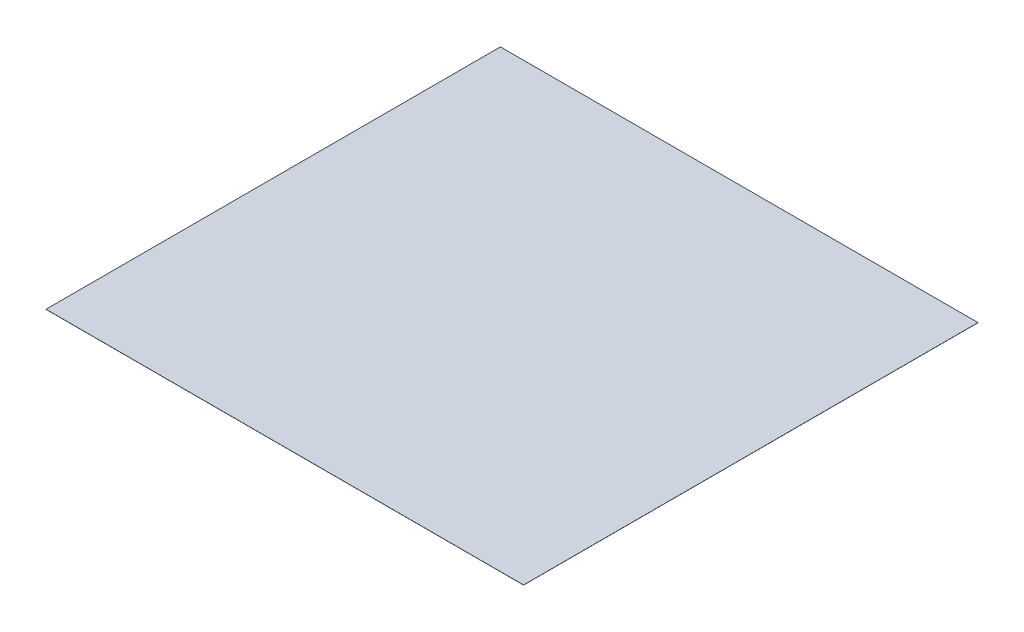
ISO-10303-21;
HEADER;
FILE_DESCRIPTION(('STEP AP214'),'2;1');
FILE_NAME('part.step','',(''),(''),'','','');
FILE_SCHEMA(('AUTOMOTIVE_DESIGN { 1 0 10303 214 1 1 1 1 }'));
ENDSEC;
DATA;
#1=APPLICATION_CONTEXT('core data for automotive mechanical design processes');
#2=APPLICATION_PROTOCOL_DEFINITION('international standard','automotive_design',2000,#1);
#3=PRODUCT_CONTEXT('',#1,'mechanical');
#4=PRODUCT('Part','Part','',(#3));
#5=PRODUCT_RELATED_PRODUCT_CATEGORY('part','',(#4));
#6=PRODUCT_DEFINITION_FORMATION('','',#4);
#7=PRODUCT_DEFINITION_CONTEXT('part definition',#1,'design');
#8=PRODUCT_DEFINITION('design','',#6,#7);
#9=PRODUCT_DEFINITION_SHAPE('','',#8);
#10=(LENGTH_UNIT() NAMED_UNIT(*) SI_UNIT(.MILLI.,.METRE.));
#11=(NAMED_UNIT(*) PLANE_ANGLE_UNIT() SI_UNIT($,.RADIAN.));
#12=(NAMED_UNIT(*) SI_UNIT($,.STERADIAN.) SOLID_ANGLE_UNIT());
#13=UNCERTAINTY_MEASURE_WITH_UNIT(LENGTH_MEASURE(1.E-05),#10,'distance_accuracy_value','');
#14=(GEOMETRIC_REPRESENTATION_CONTEXT(3) GLOBAL_UNCERTAINTY_ASSIGNED_CONTEXT((#13)) GLOBAL_UNIT_ASSIGNED_CONTEXT((#10,
#11,#12)) REPRESENTATION_CONTEXT('',''));
#15=CARTESIAN_POINT('',(0.,0.,0.));
#16=DIRECTION('',(0.,0.,1.));
#17=DIRECTION('',(1.,0.,0.));
#18=AXIS2_PLACEMENT_3D('',#15,#16,#17);
#19=CARTESIAN_POINT('',(-99.9617841572377,0.05,-56.4313214233377));
#20=DIRECTION('',(1.,0.,0.));
#21=DIRECTION('',(0.,0.,-1.));
#22=AXIS2_PLACEMENT_3D('',#19,#20,#21);
#23=PLANE('',#22);
#24=DIRECTION('',(0.,0.,1.));
#25=VECTOR('',#24,1.);
#26=CARTESIAN_POINT('',(-99.9617841572377,0.,-56.4313214233377));
#27=LINE('',#26,#25);
#28=CARTESIAN_POINT('',(-99.9617841572377,0.,-56.4313214233377));
#29=VERTEX_POINT('',#28);
#30=CARTESIAN_POINT('',(-99.9617841572377,0.,135.620704459496));
#31=VERTEX_POINT('',#30);
#32=EDGE_CURVE('E109',#29,#31,#27,.T.);
#33=ORIENTED_EDGE('',*,*,#32,.T.);
#34=DIRECTION('',(0.,-1.,0.));
#35=VECTOR('',#34,1.);
#36=CARTESIAN_POINT('',(-99.9617841572377,0.05,135.620704459496));
#37=LINE('',#36,#35);
#38=CARTESIAN_POINT('',(-99.9617841572377,0.05,135.620704459496));
#39=VERTEX_POINT('',#38);
#40=EDGE_CURVE('E11',#39,#31,#37,.T.);
#41=ORIENTED_EDGE('',*,*,#40,.F.);
#42=DIRECTION('',(0.,0.,1.));
#43=VECTOR('',#42,1.);
#44=CARTESIAN_POINT('',(-99.9617841572377,0.05,-56.4313214233377));
#45=LINE('',#44,#43);
#46=CARTESIAN_POINT('',(-99.9617841572377,0.05,-56.4313214233377));
#47=VERTEX_POINT('',#46);
#48=EDGE_CURVE('E93',#47,#39,#45,.T.);
#49=ORIENTED_EDGE('',*,*,#48,.F.);
#50=DIRECTION('',(0.,-1.,0.));
#51=VECTOR('',#50,1.);
#52=CARTESIAN_POINT('',(-99.9617841572377,0.05,-56.4313214233377));
#53=LINE('',#52,#51);
#54=EDGE_CURVE('E105',#47,#29,#53,.T.);
#55=ORIENTED_EDGE('',*,*,#54,.T.);
#56=EDGE_LOOP('',(#33,#41,#49,#55));
#57=FACE_BOUND('',#56,.T.);
#58=ADVANCED_FACE('F41',(#57),#23,.F.);
#59=CARTESIAN_POINT('',(-99.9617841572377,0.05,135.620704459496));
#60=DIRECTION('',(0.,0.,-1.));
#61=DIRECTION('',(-1.,0.,0.));
#62=AXIS2_PLACEMENT_3D('',#59,#60,#61);
#63=PLANE('',#62);
#64=DIRECTION('',(1.,0.,0.));
#65=VECTOR('',#64,1.);
#66=CARTESIAN_POINT('',(-99.9617841572377,0.,135.620704459496));
#67=LINE('',#66,#65);
#68=CARTESIAN_POINT('',(101.875919890664,0.,135.620704459496));
#69=VERTEX_POINT('',#68);
#70=EDGE_CURVE('E98',#31,#69,#67,.T.);
#71=ORIENTED_EDGE('',*,*,#70,.T.);
#72=DIRECTION('',(0.,-1.,0.));
#73=VECTOR('',#72,1.);
#74=CARTESIAN_POINT('',(101.875919890664,0.05,135.620704459496));
#75=LINE('',#74,#73);
#76=CARTESIAN_POINT('',(101.875919890664,0.05,135.620704459496));
#77=VERTEX_POINT('',#76);
#78=EDGE_CURVE('E50',#77,#69,#75,.T.);
#79=ORIENTED_EDGE('',*,*,#78,.F.);
#80=DIRECTION('',(1.,0.,0.));
#81=VECTOR('',#80,1.);
#82=CARTESIAN_POINT('',(-99.9617841572377,0.05,135.620704459496));
#83=LINE('',#82,#81);
#84=EDGE_CURVE('E88',#39,#77,#83,.T.);
#85=ORIENTED_EDGE('',*,*,#84,.F.);
#86=ORIENTED_EDGE('',*,*,#40,.T.);
#87=EDGE_LOOP('',(#71,#79,#85,#86));
#88=FACE_BOUND('',#87,.T.);
#89=ADVANCED_FACE('F97',(#88),#63,.F.);
#90=CARTESIAN_POINT('',(101.875919890664,0.05,-56.4313214233377));
#91=DIRECTION('',(-1.,0.,0.));
#92=DIRECTION('',(0.,0.,1.));
#93=AXIS2_PLACEMENT_3D('',#90,#91,#92);
#94=PLANE('',#93);
#95=DIRECTION('',(0.,0.,-1.));
#96=VECTOR('',#95,1.);
#97=CARTESIAN_POINT('',(101.875919890664,0.,-56.4313214233377));
#98=LINE('',#97,#96);
#99=CARTESIAN_POINT('',(101.875919890664,0.,-56.4313214233377));
#100=VERTEX_POINT('',#99);
#101=EDGE_CURVE('E75',#69,#100,#98,.T.);
#102=ORIENTED_EDGE('',*,*,#101,.T.);
#103=DIRECTION('',(0.,-1.,0.));
#104=VECTOR('',#103,1.);
#105=CARTESIAN_POINT('',(101.875919890664,0.05,-56.4313214233377));
#106=LINE('',#105,#104);
#107=CARTESIAN_POINT('',(101.875919890664,0.05,-56.4313214233377));
#108=VERTEX_POINT('',#107);
#109=EDGE_CURVE('E100',#108,#100,#106,.T.);
#110=ORIENTED_EDGE('',*,*,#109,.F.);
#111=DIRECTION('',(0.,0.,-1.));
#112=VECTOR('',#111,1.);
#113=CARTESIAN_POINT('',(101.875919890664,0.05,-56.4313214233377));
#114=LINE('',#113,#112);
#115=EDGE_CURVE('E91',#77,#108,#114,.T.);
#116=ORIENTED_EDGE('',*,*,#115,.F.);
#117=ORIENTED_EDGE('',*,*,#78,.T.);
#118=EDGE_LOOP('',(#102,#110,#116,#117));
#119=FACE_BOUND('',#118,.T.);
#120=ADVANCED_FACE('F101',(#119),#94,.F.);
#121=CARTESIAN_POINT('',(-99.9617841572377,0.05,-56.4313214233377));
#122=DIRECTION('',(0.,0.,1.));
#123=DIRECTION('',(1.,0.,0.));
#124=AXIS2_PLACEMENT_3D('',#121,#122,#123);
#125=PLANE('',#124);
#126=DIRECTION('',(-1.,0.,0.));
#127=VECTOR('',#126,1.);
#128=CARTESIAN_POINT('',(-99.9617841572377,0.,-56.4313214233377));
#129=LINE('',#128,#127);
#130=EDGE_CURVE('E81',#100,#29,#129,.T.);
#131=ORIENTED_EDGE('',*,*,#130,.T.);
#132=ORIENTED_EDGE('',*,*,#54,.F.);
#133=DIRECTION('',(-1.,0.,0.));
#134=VECTOR('',#133,1.);
#135=CARTESIAN_POINT('',(-99.9617841572377,0.05,-56.4313214233377));
#136=LINE('',#135,#134);
#137=EDGE_CURVE('E58',#108,#47,#136,.T.);
#138=ORIENTED_EDGE('',*,*,#137,.F.);
#139=ORIENTED_EDGE('',*,*,#109,.T.);
#140=EDGE_LOOP('',(#131,#132,#138,#139));
#141=FACE_BOUND('',#140,.T.);
#142=ADVANCED_FACE('F122',(#141),#125,.F.);
#143=CARTESIAN_POINT('',(0.,0.05,0.));
#144=DIRECTION('',(0.,1.,0.));
#145=DIRECTION('',(0.,0.,1.));
#146=AXIS2_PLACEMENT_3D('',#143,#144,#145);
#147=PLANE('',#146);
#148=ORIENTED_EDGE('',*,*,#48,.T.);
#149=ORIENTED_EDGE('',*,*,#84,.T.);
#150=ORIENTED_EDGE('',*,*,#115,.T.);
#151=ORIENTED_EDGE('',*,*,#137,.T.);
#152=EDGE_LOOP('',(#148,#149,#150,#151));
#153=FACE_BOUND('',#152,.T.);
#154=ADVANCED_FACE('F89',(#153),#147,.T.);
#155=CARTESIAN_POINT('',(0.,0.,0.));
#156=DIRECTION('',(0.,1.,0.));
#157=DIRECTION('',(0.,0.,1.));
#158=AXIS2_PLACEMENT_3D('',#155,#156,#157);
#159=PLANE('',#158);
#160=ORIENTED_EDGE('',*,*,#32,.F.);
#161=ORIENTED_EDGE('',*,*,#130,.F.);
#162=ORIENTED_EDGE('',*,*,#101,.F.);
#163=ORIENTED_EDGE('',*,*,#70,.F.);
#164=EDGE_LOOP('',(#160,#161,#162,#163));
#165=FACE_BOUND('',#164,.T.);
#166=ADVANCED_FACE('F125',(#165),#159,.F.);
#167=CLOSED_SHELL('',(#58,#89,#120,#142,#154,#166));
#168=MANIFOLD_SOLID_BREP('B2',#167);
#169=ADVANCED_BREP_SHAPE_REPRESENTATION('',(#18,#168),#14);
#170=SHAPE_DEFINITION_REPRESENTATION(#9,#169);
ENDSEC;
END-ISO-10303-21;
